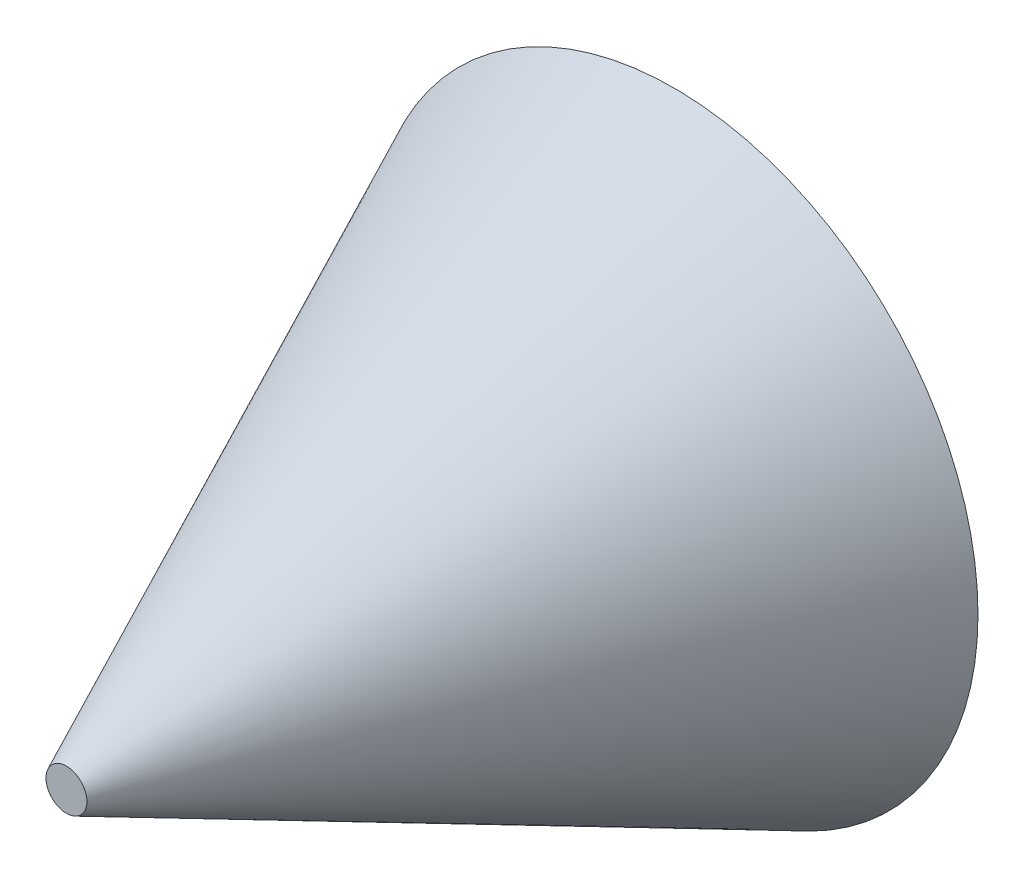
ISO-10303-21;
HEADER;
FILE_DESCRIPTION(('STEP AP214'),'2;1');
FILE_NAME('part.step','',(''),(''),'','','');
FILE_SCHEMA(('AUTOMOTIVE_DESIGN { 1 0 10303 214 1 1 1 1 }'));
ENDSEC;
DATA;
#1=APPLICATION_CONTEXT('core data for automotive mechanical design processes');
#2=APPLICATION_PROTOCOL_DEFINITION('international standard','automotive_design',2000,#1);
#3=PRODUCT_CONTEXT('',#1,'mechanical');
#4=PRODUCT('Part','Part','',(#3));
#5=PRODUCT_RELATED_PRODUCT_CATEGORY('part','',(#4));
#6=PRODUCT_DEFINITION_FORMATION('','',#4);
#7=PRODUCT_DEFINITION_CONTEXT('part definition',#1,'design');
#8=PRODUCT_DEFINITION('design','',#6,#7);
#9=PRODUCT_DEFINITION_SHAPE('','',#8);
#10=(LENGTH_UNIT() NAMED_UNIT(*) SI_UNIT(.MILLI.,.METRE.));
#11=(NAMED_UNIT(*) PLANE_ANGLE_UNIT() SI_UNIT($,.RADIAN.));
#12=(NAMED_UNIT(*) SI_UNIT($,.STERADIAN.) SOLID_ANGLE_UNIT());
#13=UNCERTAINTY_MEASURE_WITH_UNIT(LENGTH_MEASURE(1.E-05),#10,'distance_accuracy_value','');
#14=(GEOMETRIC_REPRESENTATION_CONTEXT(3) GLOBAL_UNCERTAINTY_ASSIGNED_CONTEXT((#13)) GLOBAL_UNIT_ASSIGNED_CONTEXT((#10,
#11,#12)) REPRESENTATION_CONTEXT('',''));
#15=CARTESIAN_POINT('',(0.,0.,0.));
#16=DIRECTION('',(0.,0.,1.));
#17=DIRECTION('',(1.,0.,0.));
#18=AXIS2_PLACEMENT_3D('',#15,#16,#17);
#19=CARTESIAN_POINT('',(0.,0.,0.));
#20=DIRECTION('',(0.,0.,-1.));
#21=DIRECTION('',(1.,0.,0.));
#22=AXIS2_PLACEMENT_3D('',#19,#20,#21);
#23=CONICAL_SURFACE('',#22,12.5,0.436332312998583);
#24=CARTESIAN_POINT('',(0.,0.,25.));
#25=DIRECTION('',(0.,0.,1.));
#26=DIRECTION('',(1.,0.,0.));
#27=AXIS2_PLACEMENT_3D('',#24,#25,#26);
#28=CIRCLE('',#27,0.842308546125008);
#29=CARTESIAN_POINT('',(0.842308546125008,0.,25.));
#30=VERTEX_POINT('',#29);
#31=EDGE_CURVE('E10',#30,#30,#28,.T.);
#32=CARTESIAN_POINT('',(0.,0.,0.));
#33=DIRECTION('',(0.,0.,1.));
#34=DIRECTION('',(1.,0.,0.));
#35=AXIS2_PLACEMENT_3D('',#32,#33,#34);
#36=CIRCLE('',#35,12.5);
#37=CARTESIAN_POINT('',(12.5,0.,0.));
#38=VERTEX_POINT('',#37);
#39=EDGE_CURVE('E37',#38,#38,#36,.T.);
#40=CARTESIAN_POINT('',(0.842308546125008,0.,25.));
#41=CARTESIAN_POINT('',(0.963742832102873,0.,24.7395833333333));
#42=CARTESIAN_POINT('',(1.08517711808074,0.,24.4791666666667));
#43=CARTESIAN_POINT('',(1.32804569003647,0.,23.9583333333333));
#44=CARTESIAN_POINT('',(1.44947997601433,0.,23.6979166666667));
#45=CARTESIAN_POINT('',(1.69234854797006,0.,23.1770833333333));
#46=CARTESIAN_POINT('',(1.81378283394792,0.,22.9166666666667));
#47=CARTESIAN_POINT('',(2.05665140590365,0.,22.3958333333333));
#48=CARTESIAN_POINT('',(2.17808569188152,0.,22.1354166666667));
#49=CARTESIAN_POINT('',(2.42095426383725,0.,21.6145833333333));
#50=CARTESIAN_POINT('',(2.54238854981511,0.,21.3541666666667));
#51=CARTESIAN_POINT('',(2.78525712177084,0.,20.8333333333333));
#52=CARTESIAN_POINT('',(2.9066914077487,0.,20.5729166666667));
#53=CARTESIAN_POINT('',(3.14955997970443,0.,20.0520833333333));
#54=CARTESIAN_POINT('',(3.2709942656823,0.,19.7916666666667));
#55=CARTESIAN_POINT('',(3.51386283763803,0.,19.2708333333333));
#56=CARTESIAN_POINT('',(3.63529712361589,0.,19.0104166666667));
#57=CARTESIAN_POINT('',(3.87816569557162,0.,18.4895833333333));
#58=CARTESIAN_POINT('',(3.99959998154948,0.,18.2291666666667));
#59=CARTESIAN_POINT('',(4.24246855350521,0.,17.7083333333333));
#60=CARTESIAN_POINT('',(4.36390283948308,0.,17.4479166666667));
#61=CARTESIAN_POINT('',(4.60677141143881,0.,16.9270833333333));
#62=CARTESIAN_POINT('',(4.72820569741667,0.,16.6666666666667));
#63=CARTESIAN_POINT('',(4.9710742693724,0.,16.1458333333333));
#64=CARTESIAN_POINT('',(5.09250855535027,0.,15.8854166666667));
#65=CARTESIAN_POINT('',(5.33537712730599,0.,15.3645833333333));
#66=CARTESIAN_POINT('',(5.45681141328386,0.,15.1041666666667));
#67=CARTESIAN_POINT('',(5.69967998523959,0.,14.5833333333333));
#68=CARTESIAN_POINT('',(5.82111427121745,0.,14.3229166666667));
#69=CARTESIAN_POINT('',(6.06398284317318,0.,13.8020833333333));
#70=CARTESIAN_POINT('',(6.18541712915105,0.,13.5416666666667));
#71=CARTESIAN_POINT('',(6.42828570110678,0.,13.0208333333333));
#72=CARTESIAN_POINT('',(6.54971998708464,0.,12.7604166666667));
#73=CARTESIAN_POINT('',(6.79258855904037,0.,12.2395833333333));
#74=CARTESIAN_POINT('',(6.91402284501823,0.,11.9791666666667));
#75=CARTESIAN_POINT('',(7.15689141697396,0.,11.4583333333333));
#76=CARTESIAN_POINT('',(7.27832570295183,0.,11.1979166666667));
#77=CARTESIAN_POINT('',(7.52119427490756,0.,10.6770833333333));
#78=CARTESIAN_POINT('',(7.64262856088542,0.,10.4166666666667));
#79=CARTESIAN_POINT('',(7.88549713284115,0.,9.89583333333333));
#80=CARTESIAN_POINT('',(8.00693141881901,0.,9.63541666666667));
#81=CARTESIAN_POINT('',(8.24979999077474,0.,9.11458333333334));
#82=CARTESIAN_POINT('',(8.37123427675261,0.,8.85416666666667));
#83=CARTESIAN_POINT('',(8.61410284870834,0.,8.33333333333333));
#84=CARTESIAN_POINT('',(8.7355371346862,0.,8.07291666666667));
#85=CARTESIAN_POINT('',(8.97840570664193,0.,7.55208333333333));
#86=CARTESIAN_POINT('',(9.0998399926198,0.,7.29166666666667));
#87=CARTESIAN_POINT('',(9.34270856457553,0.,6.77083333333333));
#88=CARTESIAN_POINT('',(9.46414285055339,0.,6.51041666666667));
#89=CARTESIAN_POINT('',(9.70701142250912,0.,5.98958333333333));
#90=CARTESIAN_POINT('',(9.82844570848698,0.,5.72916666666667));
#91=CARTESIAN_POINT('',(10.0713142804427,0.,5.20833333333333));
#92=CARTESIAN_POINT('',(10.1927485664206,0.,4.94791666666667));
#93=CARTESIAN_POINT('',(10.4356171383763,0.,4.42708333333333));
#94=CARTESIAN_POINT('',(10.5570514243542,0.,4.16666666666667));
#95=CARTESIAN_POINT('',(10.7999199963099,0.,3.64583333333333));
#96=CARTESIAN_POINT('',(10.9213542822878,0.,3.38541666666667));
#97=CARTESIAN_POINT('',(11.1642228542435,0.,2.86458333333333));
#98=CARTESIAN_POINT('',(11.2856571402214,0.,2.60416666666667));
#99=CARTESIAN_POINT('',(11.5285257121771,0.,2.08333333333333));
#100=CARTESIAN_POINT('',(11.6499599981549,0.,1.82291666666667));
#101=CARTESIAN_POINT('',(11.8928285701107,0.,1.30208333333333));
#102=CARTESIAN_POINT('',(12.0142628560885,0.,1.04166666666667));
#103=CARTESIAN_POINT('',(12.2571314280443,0.,0.520833333333334));
#104=CARTESIAN_POINT('',(12.3785657140221,0.,0.260416666666667));
#105=CARTESIAN_POINT('',(12.5,0.,0.));
#106=B_SPLINE_CURVE_WITH_KNOTS('',3,(#40,#41,#42,#43,#44,#45,#46,#47,#48,#49,#50,#51,#52,#53,
#54,#55,#56,#57,#58,#59,#60,#61,#62,#63,#64,#65,#66,#67,#68,#69,#70,#71,#72,#73,#74,#75,#76,#77,
#78,#79,#80,#81,#82,#83,#84,#85,#86,#87,#88,#89,#90,#91,#92,#93,#94,#95,#96,#97,#98,#99,#100,
#101,#102,#103,#104,#105),.UNSPECIFIED.,.F.,.F.,(4,2,2,2,2,2,2,2,2,2,2,2,2,2,2,2,2,2,2,2,2,2,2,
2,2,2,2,2,2,2,2,2,4),(0.,0.862013999189448,1.7240279983789,2.58604199756834,3.44805599675779,
4.31006999594724,5.17208399513668,6.03409799432613,6.89611199351558,7.75812599270502,
8.62013999189447,9.48215399108392,10.3441679902734,11.2061819894628,12.0681959886523,
12.9302099878417,13.7922239870312,14.6542379862206,15.5162519854101,16.3782659845995,
17.2402799837889,18.1022939829784,18.9643079821678,19.8263219813573,20.6883359805467,
21.5503499797362,22.4123639789256,23.2743779781151,24.1363919773045,24.998405976494,
25.8604199756834,26.7224339748729,27.5844479740623),.UNSPECIFIED.);
#107=EDGE_CURVE('BSEAM31',#30,#38,#106,.T.);
#108=ORIENTED_EDGE('',*,*,#31,.F.);
#109=ORIENTED_EDGE('',*,*,#39,.T.);
#110=ORIENTED_EDGE('',*,*,#107,.T.);
#111=ORIENTED_EDGE('',*,*,#107,.F.);
#112=EDGE_LOOP('',(#108,#110,#109,#111));
#113=FACE_BOUND('',#112,.T.);
#114=ADVANCED_FACE('F31',(#113),#23,.T.);
#115=CARTESIAN_POINT('',(0.,0.,25.));
#116=DIRECTION('',(0.,0.,1.));
#117=DIRECTION('',(1.,0.,0.));
#118=AXIS2_PLACEMENT_3D('',#115,#116,#117);
#119=PLANE('',#118);
#120=ORIENTED_EDGE('',*,*,#31,.T.);
#121=EDGE_LOOP('',(#120));
#122=FACE_BOUND('',#121,.T.);
#123=ADVANCED_FACE('F46',(#122),#119,.T.);
#124=CARTESIAN_POINT('',(0.,0.,0.));
#125=DIRECTION('',(0.,0.,1.));
#126=DIRECTION('',(1.,0.,0.));
#127=AXIS2_PLACEMENT_3D('',#124,#125,#126);
#128=PLANE('',#127);
#129=ORIENTED_EDGE('',*,*,#39,.F.);
#130=EDGE_LOOP('',(#129));
#131=FACE_BOUND('',#130,.T.);
#132=ADVANCED_FACE('F44',(#131),#128,.F.);
#133=CLOSED_SHELL('',(#114,#123,#132));
#134=MANIFOLD_SOLID_BREP('B2',#133);
#135=ADVANCED_BREP_SHAPE_REPRESENTATION('',(#18,#134),#14);
#136=SHAPE_DEFINITION_REPRESENTATION(#9,#135);
ENDSEC;
END-ISO-10303-21;
